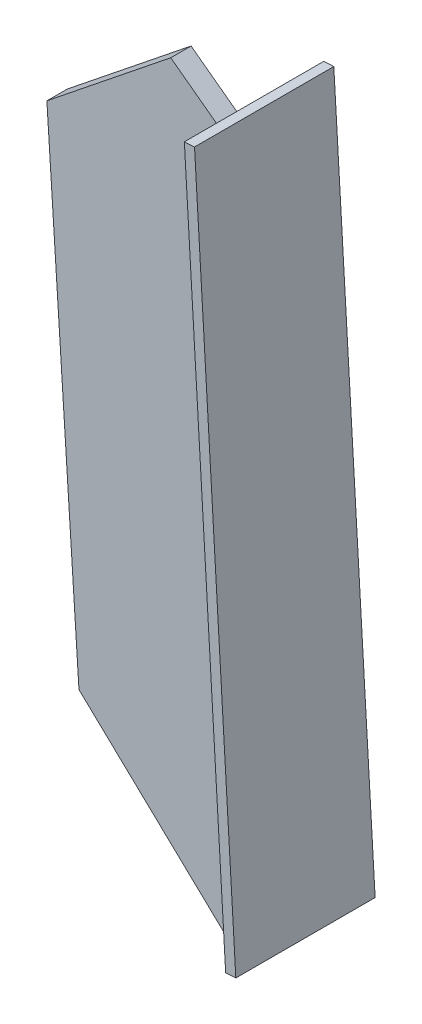
ISO-10303-21;
HEADER;
FILE_DESCRIPTION(('STEP AP214'),'2;1');
FILE_NAME('part.step','',(''),(''),'','','');
FILE_SCHEMA(('AUTOMOTIVE_DESIGN { 1 0 10303 214 1 1 1 1 }'));
ENDSEC;
DATA;
#1=APPLICATION_CONTEXT('core data for automotive mechanical design processes');
#2=APPLICATION_PROTOCOL_DEFINITION('international standard','automotive_design',2000,#1);
#3=PRODUCT_CONTEXT('',#1,'mechanical');
#4=PRODUCT('Part','Part','',(#3));
#5=PRODUCT_RELATED_PRODUCT_CATEGORY('part','',(#4));
#6=PRODUCT_DEFINITION_FORMATION('','',#4);
#7=PRODUCT_DEFINITION_CONTEXT('part definition',#1,'design');
#8=PRODUCT_DEFINITION('design','',#6,#7);
#9=PRODUCT_DEFINITION_SHAPE('','',#8);
#10=(LENGTH_UNIT() NAMED_UNIT(*) SI_UNIT(.MILLI.,.METRE.));
#11=(NAMED_UNIT(*) PLANE_ANGLE_UNIT() SI_UNIT($,.RADIAN.));
#12=(NAMED_UNIT(*) SI_UNIT($,.STERADIAN.) SOLID_ANGLE_UNIT());
#13=UNCERTAINTY_MEASURE_WITH_UNIT(LENGTH_MEASURE(1.E-05),#10,'distance_accuracy_value','');
#14=(GEOMETRIC_REPRESENTATION_CONTEXT(3) GLOBAL_UNCERTAINTY_ASSIGNED_CONTEXT((#13)) GLOBAL_UNIT_ASSIGNED_CONTEXT((#10,
#11,#12)) REPRESENTATION_CONTEXT('',''));
#15=CARTESIAN_POINT('',(0.,0.,0.));
#16=DIRECTION('',(0.,0.,1.));
#17=DIRECTION('',(1.,0.,0.));
#18=AXIS2_PLACEMENT_3D('',#15,#16,#17);
#19=CARTESIAN_POINT('',(7.06392086814477,-18.4519032278726,0.));
#20=DIRECTION('',(0.998258221981907,0.0589959510943081,0.));
#21=DIRECTION('',(-0.0589959510943081,0.998258221981907,0.));
#22=AXIS2_PLACEMENT_3D('',#19,#20,#21);
#23=PLANE('',#22);
#24=DIRECTION('',(-0.0589959510943081,0.998258221981907,0.));
#25=VECTOR('',#24,1.);
#26=CARTESIAN_POINT('',(7.06392086814477,-18.4519032278726,0.));
#27=LINE('',#26,#25);
#28=CARTESIAN_POINT('',(6.81248094543901,-14.1973405753563,0.));
#29=VERTEX_POINT('',#28);
#30=CARTESIAN_POINT('',(6.77528347098354,-13.5679298442236,0.));
#31=VERTEX_POINT('',#30);
#32=EDGE_CURVE('E289',#29,#31,#27,.T.);
#33=ORIENTED_EDGE('',*,*,#32,.T.);
#34=CARTESIAN_POINT('',(6.77528347098354,-13.5679298442236,0.599999999999668));
#35=DIRECTION('',(0.998258221981907,0.0589959510943081,0.));
#36=DIRECTION('',(-0.0589959510943081,0.998258221981907,0.));
#37=AXIS2_PLACEMENT_3D('',#34,#35,#36);
#38=CIRCLE('',#37,0.6);
#39=CARTESIAN_POINT('',(6.77528347098354,-13.5679298442236,1.2));
#40=VERTEX_POINT('',#39);
#41=EDGE_CURVE('E110',#40,#31,#38,.T.);
#42=ORIENTED_EDGE('',*,*,#41,.F.);
#43=DIRECTION('',(-0.0589959510943081,0.998258221981907,0.));
#44=VECTOR('',#43,1.);
#45=CARTESIAN_POINT('',(7.06392086814477,-18.4519032278726,1.2));
#46=LINE('',#45,#44);
#47=CARTESIAN_POINT('',(6.81248094543901,-14.1973405753563,1.2));
#48=VERTEX_POINT('',#47);
#49=EDGE_CURVE('E386',#48,#40,#46,.T.);
#50=ORIENTED_EDGE('',*,*,#49,.F.);
#51=DIRECTION('',(0.,0.,1.));
#52=VECTOR('',#51,1.);
#53=CARTESIAN_POINT('',(6.81248094543901,-14.1973405753563,0.));
#54=LINE('',#53,#52);
#55=EDGE_CURVE('E96',#29,#48,#54,.T.);
#56=ORIENTED_EDGE('',*,*,#55,.F.);
#57=EDGE_LOOP('',(#33,#42,#50,#56));
#58=FACE_BOUND('',#57,.T.);
#59=ADVANCED_FACE('F92',(#58),#23,.T.);
#60=CARTESIAN_POINT('',(6.30567570027285,-5.62179439724764,1.2));
#61=VERTEX_POINT('',#60);
#62=EDGE_CURVE('E394',#40,#61,#46,.T.);
#63=ORIENTED_EDGE('',*,*,#62,.F.);
#64=EDGE_CURVE('E240',#31,#40,#38,.T.);
#65=ORIENTED_EDGE('',*,*,#64,.F.);
#66=CARTESIAN_POINT('',(6.30567570027285,-5.62179439724764,0.));
#67=VERTEX_POINT('',#66);
#68=EDGE_CURVE('E117',#31,#67,#27,.T.);
#69=ORIENTED_EDGE('',*,*,#68,.T.);
#70=CARTESIAN_POINT('',(6.30567570027285,-5.62179439724764,0.599999999999751));
#71=DIRECTION('',(0.998258221981907,0.0589959510943081,0.));
#72=DIRECTION('',(-0.0589959510943081,0.998258221981907,0.));
#73=AXIS2_PLACEMENT_3D('',#70,#71,#72);
#74=CIRCLE('',#73,0.6);
#75=EDGE_CURVE('E249',#61,#67,#74,.T.);
#76=ORIENTED_EDGE('',*,*,#75,.F.);
#77=EDGE_LOOP('',(#63,#65,#69,#76));
#78=FACE_BOUND('',#77,.T.);
#79=ADVANCED_FACE('F318',(#78),#23,.T.);
#80=CARTESIAN_POINT('',(5.83606792956216,2.32434104972834,1.2));
#81=VERTEX_POINT('',#80);
#82=EDGE_CURVE('E398',#61,#81,#46,.T.);
#83=ORIENTED_EDGE('',*,*,#82,.F.);
#84=EDGE_CURVE('E253',#67,#61,#74,.T.);
#85=ORIENTED_EDGE('',*,*,#84,.F.);
#86=CARTESIAN_POINT('',(5.83606792956216,2.32434104972834,0.));
#87=VERTEX_POINT('',#86);
#88=EDGE_CURVE('E337',#67,#87,#27,.T.);
#89=ORIENTED_EDGE('',*,*,#88,.T.);
#90=CARTESIAN_POINT('',(5.83606792956216,2.32434104972834,0.599999999999834));
#91=DIRECTION('',(0.998258221981907,0.0589959510943081,0.));
#92=DIRECTION('',(-0.0589959510943081,0.998258221981907,0.));
#93=AXIS2_PLACEMENT_3D('',#90,#91,#92);
#94=CIRCLE('',#93,0.6);
#95=EDGE_CURVE('E257',#81,#87,#94,.T.);
#96=ORIENTED_EDGE('',*,*,#95,.F.);
#97=EDGE_LOOP('',(#83,#85,#89,#96));
#98=FACE_BOUND('',#97,.T.);
#99=ADVANCED_FACE('F323',(#98),#23,.T.);
#100=CARTESIAN_POINT('',(5.36646015885146,10.2704764967043,1.2));
#101=VERTEX_POINT('',#100);
#102=EDGE_CURVE('E366',#81,#101,#46,.T.);
#103=ORIENTED_EDGE('',*,*,#102,.F.);
#104=EDGE_CURVE('E262',#87,#81,#94,.T.);
#105=ORIENTED_EDGE('',*,*,#104,.F.);
#106=CARTESIAN_POINT('',(5.36646015885146,10.2704764967043,0.));
#107=VERTEX_POINT('',#106);
#108=EDGE_CURVE('E344',#87,#107,#27,.T.);
#109=ORIENTED_EDGE('',*,*,#108,.T.);
#110=CARTESIAN_POINT('',(5.36646015885146,10.2704764967043,0.599999999999917));
#111=DIRECTION('',(0.998258221981907,0.0589959510943081,0.));
#112=DIRECTION('',(-0.0589959510943081,0.998258221981907,0.));
#113=AXIS2_PLACEMENT_3D('',#110,#111,#112);
#114=CIRCLE('',#113,0.6);
#115=EDGE_CURVE('E266',#101,#107,#114,.T.);
#116=ORIENTED_EDGE('',*,*,#115,.F.);
#117=EDGE_LOOP('',(#103,#105,#109,#116));
#118=FACE_BOUND('',#117,.T.);
#119=ADVANCED_FACE('F365',(#118),#23,.T.);
#120=CARTESIAN_POINT('',(4.89685238814077,18.2166119436803,0.6));
#121=DIRECTION('',(0.998258221981907,0.0589959510943081,0.));
#122=DIRECTION('',(-0.0589959510943081,0.998258221981907,0.));
#123=AXIS2_PLACEMENT_3D('',#120,#121,#122);
#124=CIRCLE('',#123,0.600000000000001);
#125=CARTESIAN_POINT('',(4.86145481748419,18.8155668768694,0.6));
#126=VERTEX_POINT('',#125);
#127=CARTESIAN_POINT('',(4.89685238814077,18.2166119436803,1.2));
#128=VERTEX_POINT('',#127);
#129=EDGE_CURVE('E104',#126,#128,#124,.T.);
#130=ORIENTED_EDGE('',*,*,#129,.F.);
#131=DIRECTION('',(0.,0.,1.));
#132=VECTOR('',#131,1.);
#133=CARTESIAN_POINT('',(4.86145481748419,18.8155668768694,0.));
#134=LINE('',#133,#132);
#135=CARTESIAN_POINT('',(4.86145481748419,18.8155668768694,1.2));
#136=VERTEX_POINT('',#135);
#137=EDGE_CURVE('E381',#126,#136,#134,.T.);
#138=ORIENTED_EDGE('',*,*,#137,.T.);
#139=EDGE_CURVE('E378',#128,#136,#46,.T.);
#140=ORIENTED_EDGE('',*,*,#139,.F.);
#141=EDGE_LOOP('',(#130,#138,#140));
#142=FACE_BOUND('',#141,.T.);
#143=ADVANCED_FACE('F379',(#142),#23,.T.);
#144=EDGE_CURVE('E375',#101,#128,#46,.T.);
#145=ORIENTED_EDGE('',*,*,#144,.F.);
#146=EDGE_CURVE('E270',#107,#101,#114,.T.);
#147=ORIENTED_EDGE('',*,*,#146,.F.);
#148=CARTESIAN_POINT('',(4.89685238814077,18.2166119436803,0.));
#149=VERTEX_POINT('',#148);
#150=EDGE_CURVE('E339',#107,#149,#27,.T.);
#151=ORIENTED_EDGE('',*,*,#150,.T.);
#152=EDGE_CURVE('E12',#128,#149,#124,.T.);
#153=ORIENTED_EDGE('',*,*,#152,.F.);
#154=EDGE_LOOP('',(#145,#147,#151,#153));
#155=FACE_BOUND('',#154,.T.);
#156=ADVANCED_FACE('F315',(#155),#23,.T.);
#157=CARTESIAN_POINT('',(6.86579193615196,-18.4636124274813,0.));
#158=DIRECTION('',(0.,0.,-1.));
#159=DIRECTION('',(-1.,0.,0.));
#160=AXIS2_PLACEMENT_3D('',#157,#158,#159);
#161=PLANE('',#160);
#162=ORIENTED_EDGE('',*,*,#32,.F.);
#163=CARTESIAN_POINT('',(4.6839542209878,-22.0398777976443,0.));
#164=CARTESIAN_POINT('',(5.07720526534967,-21.4654182531291,0.));
#165=CARTESIAN_POINT('',(5.46950507586602,-20.8903709946747,0.));
#166=CARTESIAN_POINT('',(6.09241437546083,-19.6403771141987,0.));
#167=CARTESIAN_POINT('',(6.31690290558727,-18.988458607881,0.));
#168=CARTESIAN_POINT('',(6.57566644419785,-17.9883287398588,0.));
#169=CARTESIAN_POINT('',(6.64804921460904,-17.6508411961403,0.));
#170=CARTESIAN_POINT('',(6.76073477555897,-16.9663591369045,0.));
#171=CARTESIAN_POINT('',(6.8006211618326,-16.6197088473955,0.));
#172=CARTESIAN_POINT('',(6.86422980411761,-15.582878491165,0.));
#173=CARTESIAN_POINT('',(6.83803229534,-14.8901022052243,0.));
#174=CARTESIAN_POINT('',(6.81248094543901,-14.1973405753563,0.));
#175=B_SPLINE_CURVE_WITH_KNOTS('',3,(#163,#164,#165,#166,#167,#168,#169,#170,#171,#172,#173,
#174),.UNSPECIFIED.,.F.,.F.,(4,2,2,2,2,4),(0.,0.25,0.499999999999999,0.624999999999999,
0.749999999999999,1.),.UNSPECIFIED.);
#176=CARTESIAN_POINT('',(4.68395422098781,-22.0398777976443,0.));
#177=VERTEX_POINT('',#176);
#178=EDGE_CURVE('E281',#177,#29,#175,.T.);
#179=ORIENTED_EDGE('',*,*,#178,.F.);
#180=DIRECTION('',(0.725168620992119,-0.688571326100926,0.));
#181=VECTOR('',#180,1.);
#182=CARTESIAN_POINT('',(4.04557846421148,-21.4337191351351,0.));
#183=LINE('',#182,#181);
#184=CARTESIAN_POINT('',(-4.98946800127627,-12.8546469772515,0.));
#185=VERTEX_POINT('',#184);
#186=EDGE_CURVE('E468',#185,#177,#183,.T.);
#187=ORIENTED_EDGE('',*,*,#186,.F.);
#188=DIRECTION('',(0.0648427305672514,-0.997895495677069,0.));
#189=VECTOR('',#188,1.);
#190=CARTESIAN_POINT('',(-4.57668639002649,-19.207138720906,0.));
#191=LINE('',#190,#189);
#192=CARTESIAN_POINT('',(-6.8813922693408,16.2610717586469,0.));
#193=VERTEX_POINT('',#192);
#194=EDGE_CURVE('E472',#193,#185,#191,.T.);
#195=ORIENTED_EDGE('',*,*,#194,.F.);
#196=DIRECTION('',(-0.780499030765868,-0.625156990661979,0.));
#197=VECTOR('',#196,1.);
#198=CARTESIAN_POINT('',(-15.4502687790407,9.39765125330478,0.));
#199=LINE('',#198,#197);
#200=CARTESIAN_POINT('',(0.419413415900082,22.108804467699,0.));
#201=VERTEX_POINT('',#200);
#202=EDGE_CURVE('E336',#201,#193,#199,.T.);
#203=ORIENTED_EDGE('',*,*,#202,.F.);
#204=DIRECTION('',(-0.803311771616123,0.595558727232643,0.));
#205=VECTOR('',#204,1.);
#206=CARTESIAN_POINT('',(23.9899534271617,4.6340937696947,0.));
#207=LINE('',#206,#205);
#208=CARTESIAN_POINT('',(4.86145481748419,18.8155668768694,0.));
#209=VERTEX_POINT('',#208);
#210=EDGE_CURVE('E332',#209,#201,#207,.T.);
#211=ORIENTED_EDGE('',*,*,#210,.F.);
#212=EDGE_CURVE('E287',#149,#209,#27,.T.);
#213=ORIENTED_EDGE('',*,*,#212,.F.);
#214=ORIENTED_EDGE('',*,*,#150,.F.);
#215=ORIENTED_EDGE('',*,*,#108,.F.);
#216=ORIENTED_EDGE('',*,*,#88,.F.);
#217=ORIENTED_EDGE('',*,*,#68,.F.);
#218=EDGE_LOOP('',(#162,#179,#187,#195,#203,#211,#213,#214,#215,#216,#217));
#219=FACE_BOUND('',#218,.T.);
#220=ADVANCED_FACE('F94',(#219),#161,.T.);
#221=DIRECTION('',(0.,0.,1.));
#222=VECTOR('',#221,1.);
#223=SURFACE_OF_LINEAR_EXTRUSION('',#175,#222);
#224=CARTESIAN_POINT('',(4.6839542209878,-22.0398777976443,1.2));
#225=CARTESIAN_POINT('',(5.07720526534967,-21.4654182531291,1.2));
#226=CARTESIAN_POINT('',(5.46950507586602,-20.8903709946747,1.2));
#227=CARTESIAN_POINT('',(6.09241437546083,-19.6403771141987,1.2));
#228=CARTESIAN_POINT('',(6.31690290558727,-18.988458607881,1.2));
#229=CARTESIAN_POINT('',(6.57566644419785,-17.9883287398588,1.2));
#230=CARTESIAN_POINT('',(6.64804921460904,-17.6508411961403,1.2));
#231=CARTESIAN_POINT('',(6.76073477555897,-16.9663591369045,1.2));
#232=CARTESIAN_POINT('',(6.8006211618326,-16.6197088473955,1.2));
#233=CARTESIAN_POINT('',(6.86422980411761,-15.582878491165,1.2));
#234=CARTESIAN_POINT('',(6.83803229534,-14.8901022052243,1.2));
#235=CARTESIAN_POINT('',(6.81248094543901,-14.1973405753563,1.2));
#236=B_SPLINE_CURVE_WITH_KNOTS('',3,(#224,#225,#226,#227,#228,#229,#230,#231,#232,#233,#234,
#235),.UNSPECIFIED.,.F.,.F.,(4,2,2,2,2,4),(0.,0.25,0.499999999999999,0.624999999999999,
0.749999999999999,1.),.UNSPECIFIED.);
#237=CARTESIAN_POINT('',(4.68395422098781,-22.0398777976443,1.2));
#238=VERTEX_POINT('',#237);
#239=EDGE_CURVE('E277',#238,#48,#236,.T.);
#240=ORIENTED_EDGE('',*,*,#239,.F.);
#241=DIRECTION('',(0.,0.,1.));
#242=VECTOR('',#241,1.);
#243=CARTESIAN_POINT('',(4.68395422098781,-22.0398777976443,0.));
#244=LINE('',#243,#242);
#245=EDGE_CURVE('E454',#177,#238,#244,.T.);
#246=ORIENTED_EDGE('',*,*,#245,.F.);
#247=ORIENTED_EDGE('',*,*,#178,.T.);
#248=ORIENTED_EDGE('',*,*,#55,.T.);
#249=EDGE_LOOP('',(#240,#246,#247,#248));
#250=FACE_BOUND('',#249,.T.);
#251=ADVANCED_FACE('F295',(#250),#223,.T.);
#252=CARTESIAN_POINT('',(4.04557846421148,-21.4337191351351,0.));
#253=DIRECTION('',(-0.688571326100926,-0.725168620992119,0.));
#254=DIRECTION('',(0.725168620992119,-0.688571326100926,0.));
#255=AXIS2_PLACEMENT_3D('',#252,#253,#254);
#256=PLANE('',#255);
#257=DIRECTION('',(0.725168620992119,-0.688571326100926,0.));
#258=VECTOR('',#257,1.);
#259=CARTESIAN_POINT('',(4.04557846421148,-21.4337191351351,1.2));
#260=LINE('',#259,#258);
#261=CARTESIAN_POINT('',(-4.98946800127627,-12.8546469772515,1.2));
#262=VERTEX_POINT('',#261);
#263=EDGE_CURVE('E288',#262,#238,#260,.T.);
#264=ORIENTED_EDGE('',*,*,#263,.F.);
#265=DIRECTION('',(0.,0.,1.));
#266=VECTOR('',#265,1.);
#267=CARTESIAN_POINT('',(-4.98946800127627,-12.8546469772515,0.));
#268=LINE('',#267,#266);
#269=EDGE_CURVE('E457',#185,#262,#268,.T.);
#270=ORIENTED_EDGE('',*,*,#269,.F.);
#271=ORIENTED_EDGE('',*,*,#186,.T.);
#272=ORIENTED_EDGE('',*,*,#245,.T.);
#273=EDGE_LOOP('',(#264,#270,#271,#272));
#274=FACE_BOUND('',#273,.T.);
#275=ADVANCED_FACE('F298',(#274),#256,.T.);
#276=CARTESIAN_POINT('',(-4.57668639002649,-19.207138720906,0.));
#277=DIRECTION('',(-0.997895495677069,-0.0648427305672514,0.));
#278=DIRECTION('',(0.0648427305672514,-0.997895495677069,0.));
#279=AXIS2_PLACEMENT_3D('',#276,#277,#278);
#280=PLANE('',#279);
#281=DIRECTION('',(0.0648427305672514,-0.997895495677069,0.));
#282=VECTOR('',#281,1.);
#283=CARTESIAN_POINT('',(-4.57668639002649,-19.207138720906,1.2));
#284=LINE('',#283,#282);
#285=CARTESIAN_POINT('',(-6.8813922693408,16.2610717586469,1.2));
#286=VERTEX_POINT('',#285);
#287=EDGE_CURVE('E446',#286,#262,#284,.T.);
#288=ORIENTED_EDGE('',*,*,#287,.F.);
#289=DIRECTION('',(0.,0.,1.));
#290=VECTOR('',#289,1.);
#291=CARTESIAN_POINT('',(-6.8813922693408,16.2610717586469,0.));
#292=LINE('',#291,#290);
#293=EDGE_CURVE('E460',#193,#286,#292,.T.);
#294=ORIENTED_EDGE('',*,*,#293,.F.);
#295=ORIENTED_EDGE('',*,*,#194,.T.);
#296=ORIENTED_EDGE('',*,*,#269,.T.);
#297=EDGE_LOOP('',(#288,#294,#295,#296));
#298=FACE_BOUND('',#297,.T.);
#299=ADVANCED_FACE('F428',(#298),#280,.T.);
#300=CARTESIAN_POINT('',(-15.4502687790407,9.39765125330478,0.));
#301=DIRECTION('',(-0.625156990661979,0.780499030765868,0.));
#302=DIRECTION('',(-0.780499030765868,-0.625156990661979,0.));
#303=AXIS2_PLACEMENT_3D('',#300,#301,#302);
#304=PLANE('',#303);
#305=DIRECTION('',(-0.780499030765868,-0.625156990661979,0.));
#306=VECTOR('',#305,1.);
#307=CARTESIAN_POINT('',(-15.4502687790407,9.39765125330478,1.2));
#308=LINE('',#307,#306);
#309=CARTESIAN_POINT('',(0.419413415900082,22.108804467699,1.2));
#310=VERTEX_POINT('',#309);
#311=EDGE_CURVE('E397',#310,#286,#308,.T.);
#312=ORIENTED_EDGE('',*,*,#311,.F.);
#313=DIRECTION('',(0.,0.,1.));
#314=VECTOR('',#313,1.);
#315=CARTESIAN_POINT('',(0.419413415900082,22.108804467699,0.));
#316=LINE('',#315,#314);
#317=EDGE_CURVE('E440',#201,#310,#316,.T.);
#318=ORIENTED_EDGE('',*,*,#317,.F.);
#319=ORIENTED_EDGE('',*,*,#202,.T.);
#320=ORIENTED_EDGE('',*,*,#293,.T.);
#321=EDGE_LOOP('',(#312,#318,#319,#320));
#322=FACE_BOUND('',#321,.T.);
#323=ADVANCED_FACE('F432',(#322),#304,.T.);
#324=CARTESIAN_POINT('',(23.9899534271617,4.6340937696947,0.));
#325=DIRECTION('',(0.595558727232643,0.803311771616123,0.));
#326=DIRECTION('',(-0.803311771616123,0.595558727232643,0.));
#327=AXIS2_PLACEMENT_3D('',#324,#325,#326);
#328=PLANE('',#327);
#329=DIRECTION('',(-0.803311771616123,0.595558727232643,0.));
#330=VECTOR('',#329,1.);
#331=CARTESIAN_POINT('',(23.9899534271617,4.6340937696947,1.2));
#332=LINE('',#331,#330);
#333=EDGE_CURVE('E393',#136,#310,#332,.T.);
#334=ORIENTED_EDGE('',*,*,#333,.F.);
#335=ORIENTED_EDGE('',*,*,#137,.F.);
#336=EDGE_CURVE('E464',#209,#126,#134,.T.);
#337=ORIENTED_EDGE('',*,*,#336,.F.);
#338=ORIENTED_EDGE('',*,*,#210,.T.);
#339=ORIENTED_EDGE('',*,*,#317,.T.);
#340=EDGE_LOOP('',(#334,#335,#337,#338,#339));
#341=FACE_BOUND('',#340,.T.);
#342=ADVANCED_FACE('F313',(#341),#328,.T.);
#343=EDGE_CURVE('E102',#149,#126,#124,.T.);
#344=ORIENTED_EDGE('',*,*,#343,.F.);
#345=ORIENTED_EDGE('',*,*,#212,.T.);
#346=ORIENTED_EDGE('',*,*,#336,.T.);
#347=EDGE_LOOP('',(#344,#345,#346));
#348=FACE_BOUND('',#347,.T.);
#349=ADVANCED_FACE('F300',(#348),#23,.T.);
#350=CARTESIAN_POINT('',(6.86579193615196,-18.4636124274813,1.2));
#351=DIRECTION('',(0.,0.,-1.));
#352=DIRECTION('',(-1.,0.,0.));
#353=AXIS2_PLACEMENT_3D('',#350,#351,#352);
#354=PLANE('',#353);
#355=ORIENTED_EDGE('',*,*,#239,.T.);
#356=ORIENTED_EDGE('',*,*,#49,.T.);
#357=ORIENTED_EDGE('',*,*,#62,.T.);
#358=ORIENTED_EDGE('',*,*,#82,.T.);
#359=ORIENTED_EDGE('',*,*,#102,.T.);
#360=ORIENTED_EDGE('',*,*,#144,.T.);
#361=ORIENTED_EDGE('',*,*,#139,.T.);
#362=ORIENTED_EDGE('',*,*,#333,.T.);
#363=ORIENTED_EDGE('',*,*,#311,.T.);
#364=ORIENTED_EDGE('',*,*,#287,.T.);
#365=ORIENTED_EDGE('',*,*,#263,.T.);
#366=EDGE_LOOP('',(#355,#356,#357,#358,#359,#360,#361,#362,#363,#364,#365));
#367=FACE_BOUND('',#366,.T.);
#368=ADVANCED_FACE('F302',(#367),#354,.F.);
#369=CARTESIAN_POINT('',(5.19632985473534,18.2343107290086,0.6));
#370=DIRECTION('',(-0.998258221981907,-0.0589959510943081,0.));
#371=DIRECTION('',(0.0589959510943081,-0.998258221981907,0.));
#372=AXIS2_PLACEMENT_3D('',#369,#370,#371);
#373=CYLINDRICAL_SURFACE('',#372,0.600000000000001);
#374=CARTESIAN_POINT('',(5.19632985473534,18.2343107290086,0.6));
#375=DIRECTION('',(0.998258221981907,0.0589959510943081,0.));
#376=DIRECTION('',(-0.0589959510943081,0.998258221981907,0.));
#377=AXIS2_PLACEMENT_3D('',#374,#375,#376);
#378=CIRCLE('',#377,0.600000000000001);
#379=CARTESIAN_POINT('',(5.16093228407876,18.8332656621977,0.6));
#380=VERTEX_POINT('',#379);
#381=EDGE_CURVE('E274',#380,#380,#378,.T.);
#382=ORIENTED_EDGE('',*,*,#381,.F.);
#383=EDGE_LOOP('',(#382));
#384=FACE_BOUND('',#383,.T.);
#385=ORIENTED_EDGE('',*,*,#129,.T.);
#386=ORIENTED_EDGE('',*,*,#152,.T.);
#387=ORIENTED_EDGE('',*,*,#343,.T.);
#388=EDGE_LOOP('',(#385,#386,#387));
#389=FACE_BOUND('',#388,.T.);
#390=ADVANCED_FACE('F304',(#384,#389),#373,.T.);
#391=CARTESIAN_POINT('',(5.66593762544604,10.2881752820326,0.599999999999917));
#392=DIRECTION('',(-0.998258221981907,-0.0589959510943081,0.));
#393=DIRECTION('',(0.0589959510943081,-0.998258221981907,0.));
#394=AXIS2_PLACEMENT_3D('',#391,#392,#393);
#395=CYLINDRICAL_SURFACE('',#394,0.6);
#396=CARTESIAN_POINT('',(5.66593762544604,10.2881752820326,0.599999999999917));
#397=DIRECTION('',(0.998258221981907,0.0589959510943081,0.));
#398=DIRECTION('',(-0.0589959510943081,0.998258221981907,0.));
#399=AXIS2_PLACEMENT_3D('',#396,#397,#398);
#400=CIRCLE('',#399,0.6);
#401=CARTESIAN_POINT('',(5.63054005478945,10.8871302152218,0.599999999999917));
#402=VERTEX_POINT('',#401);
#403=EDGE_CURVE('E261',#402,#402,#400,.T.);
#404=ORIENTED_EDGE('',*,*,#403,.F.);
#405=EDGE_LOOP('',(#404));
#406=FACE_BOUND('',#405,.T.);
#407=ORIENTED_EDGE('',*,*,#115,.T.);
#408=ORIENTED_EDGE('',*,*,#146,.T.);
#409=EDGE_LOOP('',(#407,#408));
#410=FACE_BOUND('',#409,.T.);
#411=ADVANCED_FACE('F310',(#406,#410),#395,.T.);
#412=CARTESIAN_POINT('',(6.13554539615673,2.34203983505663,0.599999999999834));
#413=DIRECTION('',(-0.998258221981907,-0.0589959510943081,0.));
#414=DIRECTION('',(0.0589959510943081,-0.998258221981907,0.));
#415=AXIS2_PLACEMENT_3D('',#412,#413,#414);
#416=CYLINDRICAL_SURFACE('',#415,0.6);
#417=CARTESIAN_POINT('',(6.13554539615673,2.34203983505663,0.599999999999834));
#418=DIRECTION('',(0.998258221981907,0.0589959510943081,0.));
#419=DIRECTION('',(-0.0589959510943081,0.998258221981907,0.));
#420=AXIS2_PLACEMENT_3D('',#417,#418,#419);
#421=CIRCLE('',#420,0.6);
#422=CARTESIAN_POINT('',(6.10014782550014,2.94099476824578,0.599999999999834));
#423=VERTEX_POINT('',#422);
#424=EDGE_CURVE('E252',#423,#423,#421,.T.);
#425=ORIENTED_EDGE('',*,*,#424,.F.);
#426=EDGE_LOOP('',(#425));
#427=FACE_BOUND('',#426,.T.);
#428=ORIENTED_EDGE('',*,*,#95,.T.);
#429=ORIENTED_EDGE('',*,*,#104,.T.);
#430=EDGE_LOOP('',(#428,#429));
#431=FACE_BOUND('',#430,.T.);
#432=ADVANCED_FACE('F364',(#427,#431),#416,.T.);
#433=CARTESIAN_POINT('',(6.60515316686742,-5.60409561191934,0.599999999999751));
#434=DIRECTION('',(-0.998258221981907,-0.0589959510943081,0.));
#435=DIRECTION('',(0.0589959510943081,-0.998258221981907,0.));
#436=AXIS2_PLACEMENT_3D('',#433,#434,#435);
#437=CYLINDRICAL_SURFACE('',#436,0.6);
#438=CARTESIAN_POINT('',(6.60515316686742,-5.60409561191934,0.599999999999751));
#439=DIRECTION('',(0.998258221981907,0.0589959510943081,0.));
#440=DIRECTION('',(-0.0589959510943081,0.998258221981907,0.));
#441=AXIS2_PLACEMENT_3D('',#438,#439,#440);
#442=CIRCLE('',#441,0.6);
#443=CARTESIAN_POINT('',(6.56975559621084,-5.0051406787302,0.599999999999751));
#444=VERTEX_POINT('',#443);
#445=EDGE_CURVE('E247',#444,#444,#442,.T.);
#446=ORIENTED_EDGE('',*,*,#445,.F.);
#447=EDGE_LOOP('',(#446));
#448=FACE_BOUND('',#447,.T.);
#449=ORIENTED_EDGE('',*,*,#75,.T.);
#450=ORIENTED_EDGE('',*,*,#84,.T.);
#451=EDGE_LOOP('',(#449,#450));
#452=FACE_BOUND('',#451,.T.);
#453=ADVANCED_FACE('F408',(#448,#452),#437,.T.);
#454=CARTESIAN_POINT('',(7.07476093757811,-13.5502310588953,0.599999999999668));
#455=DIRECTION('',(-0.998258221981907,-0.0589959510943081,0.));
#456=DIRECTION('',(0.0589959510943081,-0.998258221981907,0.));
#457=AXIS2_PLACEMENT_3D('',#454,#455,#456);
#458=CYLINDRICAL_SURFACE('',#457,0.6);
#459=CARTESIAN_POINT('',(7.07476093757811,-13.5502310588953,0.599999999999668));
#460=DIRECTION('',(0.998258221981907,0.0589959510943081,0.));
#461=DIRECTION('',(-0.0589959510943081,0.998258221981907,0.));
#462=AXIS2_PLACEMENT_3D('',#459,#460,#461);
#463=CIRCLE('',#462,0.6);
#464=CARTESIAN_POINT('',(7.03936336692153,-12.9512761257062,0.599999999999668));
#465=VERTEX_POINT('',#464);
#466=EDGE_CURVE('E235',#465,#465,#463,.T.);
#467=ORIENTED_EDGE('',*,*,#466,.F.);
#468=EDGE_LOOP('',(#467));
#469=FACE_BOUND('',#468,.T.);
#470=ORIENTED_EDGE('',*,*,#41,.T.);
#471=ORIENTED_EDGE('',*,*,#64,.T.);
#472=EDGE_LOOP('',(#470,#471));
#473=FACE_BOUND('',#472,.T.);
#474=ADVANCED_FACE('F406',(#469,#473),#458,.T.);
#475=CARTESIAN_POINT('',(5.57430506356168,22.0088602693289,4.95282128207009));
#476=DIRECTION('',(0.,0.,-1.));
#477=DIRECTION('',(0.,1.,0.));
#478=AXIS2_PLACEMENT_3D('',#475,#476,#477);
#479=PLANE('',#478);
#480=DIRECTION('',(0.0589959510943081,-0.998258221981907,0.));
#481=VECTOR('',#480,1.);
#482=CARTESIAN_POINT('',(4.97535013037254,21.9734626986723,4.95282128207009));
#483=LINE('',#482,#481);
#484=CARTESIAN_POINT('',(4.97535013037254,21.9734626986723,4.95282128207009));
#485=VERTEX_POINT('',#484);
#486=CARTESIAN_POINT('',(7.41051146336574,-19.2313958962326,4.95282128207008));
#487=VERTEX_POINT('',#486);
#488=EDGE_CURVE('E233',#485,#487,#483,.T.);
#489=ORIENTED_EDGE('',*,*,#488,.T.);
#490=DIRECTION('',(-0.998258221981907,-0.0589959510943081,0.));
#491=VECTOR('',#490,1.);
#492=CARTESIAN_POINT('',(8.00946639655489,-19.195998325576,4.95282128207008));
#493=LINE('',#492,#491);
#494=CARTESIAN_POINT('',(8.00946639655489,-19.195998325576,4.95282128207008));
#495=VERTEX_POINT('',#494);
#496=EDGE_CURVE('E211',#495,#487,#493,.T.);
#497=ORIENTED_EDGE('',*,*,#496,.F.);
#498=DIRECTION('',(0.0589959510943081,-0.998258221981907,0.));
#499=VECTOR('',#498,1.);
#500=CARTESIAN_POINT('',(5.57430506356168,22.0088602693289,4.95282128207009));
#501=LINE('',#500,#499);
#502=CARTESIAN_POINT('',(5.57430506356168,22.0088602693289,4.95282128207009));
#503=VERTEX_POINT('',#502);
#504=EDGE_CURVE('E219',#503,#495,#501,.T.);
#505=ORIENTED_EDGE('',*,*,#504,.F.);
#506=DIRECTION('',(-0.998258221981907,-0.0589959510943081,0.));
#507=VECTOR('',#506,1.);
#508=CARTESIAN_POINT('',(5.57430506356168,22.0088602693289,4.95282128207009));
#509=LINE('',#508,#507);
#510=EDGE_CURVE('E727',#503,#485,#509,.T.);
#511=ORIENTED_EDGE('',*,*,#510,.T.);
#512=EDGE_LOOP('',(#489,#497,#505,#511));
#513=FACE_BOUND('',#512,.T.);
#514=ADVANCED_FACE('F231',(#513),#479,.F.);
#515=CARTESIAN_POINT('',(8.00946639655489,-19.195998325576,4.95282128207008));
#516=DIRECTION('',(-0.0589959510943081,0.998258221981907,0.));
#517=DIRECTION('',(-0.998258221981907,-0.0589959510943081,0.));
#518=AXIS2_PLACEMENT_3D('',#515,#516,#517);
#519=PLANE('',#518);
#520=DIRECTION('',(0.,0.,-1.));
#521=VECTOR('',#520,1.);
#522=CARTESIAN_POINT('',(7.41051146336574,-19.2313958962326,4.95282128207008));
#523=LINE('',#522,#521);
#524=CARTESIAN_POINT('',(7.41051146336574,-19.2313958962326,-3.25792043697896));
#525=VERTEX_POINT('',#524);
#526=EDGE_CURVE('E714',#487,#525,#523,.T.);
#527=ORIENTED_EDGE('',*,*,#526,.T.);
#528=DIRECTION('',(-0.998258221981907,-0.0589959510943081,0.));
#529=VECTOR('',#528,1.);
#530=CARTESIAN_POINT('',(8.00946639655489,-19.195998325576,-3.25792043697896));
#531=LINE('',#530,#529);
#532=CARTESIAN_POINT('',(8.00946639655489,-19.195998325576,-3.25792043697896));
#533=VERTEX_POINT('',#532);
#534=EDGE_CURVE('E214',#533,#525,#531,.T.);
#535=ORIENTED_EDGE('',*,*,#534,.F.);
#536=DIRECTION('',(0.,0.,-1.));
#537=VECTOR('',#536,1.);
#538=CARTESIAN_POINT('',(8.00946639655489,-19.195998325576,4.95282128207008));
#539=LINE('',#538,#537);
#540=EDGE_CURVE('E207',#495,#533,#539,.T.);
#541=ORIENTED_EDGE('',*,*,#540,.F.);
#542=ORIENTED_EDGE('',*,*,#496,.T.);
#543=EDGE_LOOP('',(#527,#535,#541,#542));
#544=FACE_BOUND('',#543,.T.);
#545=ADVANCED_FACE('F209',(#544),#519,.F.);
#546=CARTESIAN_POINT('',(5.57430506356168,22.0088602693289,-3.25792043697895));
#547=DIRECTION('',(0.,0.,1.));
#548=DIRECTION('',(0.,-1.,0.));
#549=AXIS2_PLACEMENT_3D('',#546,#547,#548);
#550=PLANE('',#549);
#551=DIRECTION('',(-0.0589959510943081,0.998258221981907,0.));
#552=VECTOR('',#551,1.);
#553=CARTESIAN_POINT('',(4.97535013037254,21.9734626986723,-3.25792043697895));
#554=LINE('',#553,#552);
#555=CARTESIAN_POINT('',(4.97535013037254,21.9734626986723,-3.25792043697895));
#556=VERTEX_POINT('',#555);
#557=EDGE_CURVE('E718',#525,#556,#554,.T.);
#558=ORIENTED_EDGE('',*,*,#557,.T.);
#559=DIRECTION('',(-0.998258221981907,-0.0589959510943081,0.));
#560=VECTOR('',#559,1.);
#561=CARTESIAN_POINT('',(5.57430506356168,22.0088602693289,-3.25792043697895));
#562=LINE('',#561,#560);
#563=CARTESIAN_POINT('',(5.57430506356168,22.0088602693289,-3.25792043697895));
#564=VERTEX_POINT('',#563);
#565=EDGE_CURVE('E242',#564,#556,#562,.T.);
#566=ORIENTED_EDGE('',*,*,#565,.F.);
#567=DIRECTION('',(-0.0589959510943081,0.998258221981907,0.));
#568=VECTOR('',#567,1.);
#569=CARTESIAN_POINT('',(5.57430506356168,22.0088602693289,-3.25792043697895));
#570=LINE('',#569,#568);
#571=EDGE_CURVE('E218',#533,#564,#570,.T.);
#572=ORIENTED_EDGE('',*,*,#571,.F.);
#573=ORIENTED_EDGE('',*,*,#534,.T.);
#574=EDGE_LOOP('',(#558,#566,#572,#573));
#575=FACE_BOUND('',#574,.T.);
#576=ADVANCED_FACE('F555',(#575),#550,.F.);
#577=CARTESIAN_POINT('',(5.57430506356168,22.0088602693289,4.95282128207009));
#578=DIRECTION('',(0.0589959510943081,-0.998258221981907,0.));
#579=DIRECTION('',(0.998258221981907,0.0589959510943081,0.));
#580=AXIS2_PLACEMENT_3D('',#577,#578,#579);
#581=PLANE('',#580);
#582=DIRECTION('',(0.,0.,1.));
#583=VECTOR('',#582,1.);
#584=CARTESIAN_POINT('',(4.97535013037254,21.9734626986723,4.95282128207009));
#585=LINE('',#584,#583);
#586=EDGE_CURVE('E229',#556,#485,#585,.T.);
#587=ORIENTED_EDGE('',*,*,#586,.T.);
#588=ORIENTED_EDGE('',*,*,#510,.F.);
#589=DIRECTION('',(0.,0.,1.));
#590=VECTOR('',#589,1.);
#591=CARTESIAN_POINT('',(5.57430506356168,22.0088602693289,4.95282128207009));
#592=LINE('',#591,#590);
#593=EDGE_CURVE('E224',#564,#503,#592,.T.);
#594=ORIENTED_EDGE('',*,*,#593,.F.);
#595=ORIENTED_EDGE('',*,*,#565,.T.);
#596=EDGE_LOOP('',(#587,#588,#594,#595));
#597=FACE_BOUND('',#596,.T.);
#598=ADVANCED_FACE('F565',(#597),#581,.F.);
#599=CARTESIAN_POINT('',(6.85107563169618,0.404890953072741,0.));
#600=DIRECTION('',(0.998258221981907,0.0589959510943081,0.));
#601=DIRECTION('',(-0.0589959510943081,0.998258221981907,0.));
#602=AXIS2_PLACEMENT_3D('',#599,#600,#601);
#603=PLANE('',#602);
#604=ORIENTED_EDGE('',*,*,#504,.T.);
#605=ORIENTED_EDGE('',*,*,#540,.T.);
#606=ORIENTED_EDGE('',*,*,#571,.T.);
#607=ORIENTED_EDGE('',*,*,#593,.T.);
#608=EDGE_LOOP('',(#604,#605,#606,#607));
#609=FACE_BOUND('',#608,.T.);
#610=ADVANCED_FACE('F222',(#609),#603,.T.);
#611=CARTESIAN_POINT('',(6.25212069850704,0.369493382416156,0.));
#612=DIRECTION('',(0.998258221981907,0.0589959510943081,0.));
#613=DIRECTION('',(-0.0589959510943081,0.998258221981907,0.));
#614=AXIS2_PLACEMENT_3D('',#611,#612,#613);
#615=PLANE('',#614);
#616=ORIENTED_EDGE('',*,*,#381,.T.);
#617=EDGE_LOOP('',(#616));
#618=FACE_BOUND('',#617,.T.);
#619=ORIENTED_EDGE('',*,*,#403,.T.);
#620=EDGE_LOOP('',(#619));
#621=FACE_BOUND('',#620,.T.);
#622=ORIENTED_EDGE('',*,*,#424,.T.);
#623=EDGE_LOOP('',(#622));
#624=FACE_BOUND('',#623,.T.);
#625=ORIENTED_EDGE('',*,*,#445,.T.);
#626=EDGE_LOOP('',(#625));
#627=FACE_BOUND('',#626,.T.);
#628=ORIENTED_EDGE('',*,*,#466,.T.);
#629=EDGE_LOOP('',(#628));
#630=FACE_BOUND('',#629,.T.);
#631=ORIENTED_EDGE('',*,*,#488,.F.);
#632=ORIENTED_EDGE('',*,*,#586,.F.);
#633=ORIENTED_EDGE('',*,*,#557,.F.);
#634=ORIENTED_EDGE('',*,*,#526,.F.);
#635=EDGE_LOOP('',(#631,#632,#633,#634));
#636=FACE_BOUND('',#635,.T.);
#637=ADVANCED_FACE('F586',(#618,#621,#624,#627,#630,#636),#615,.F.);
#638=CLOSED_SHELL('',(#59,#79,#99,#119,#143,#156,#220,#251,#275,#299,#323,#342,#349,#368,#390,
#411,#432,#453,#474,#514,#545,#576,#598,#610,#637));
#639=MANIFOLD_SOLID_BREP('B2',#638);
#640=ADVANCED_BREP_SHAPE_REPRESENTATION('',(#18,#639),#14);
#641=SHAPE_DEFINITION_REPRESENTATION(#9,#640);
ENDSEC;
END-ISO-10303-21;
